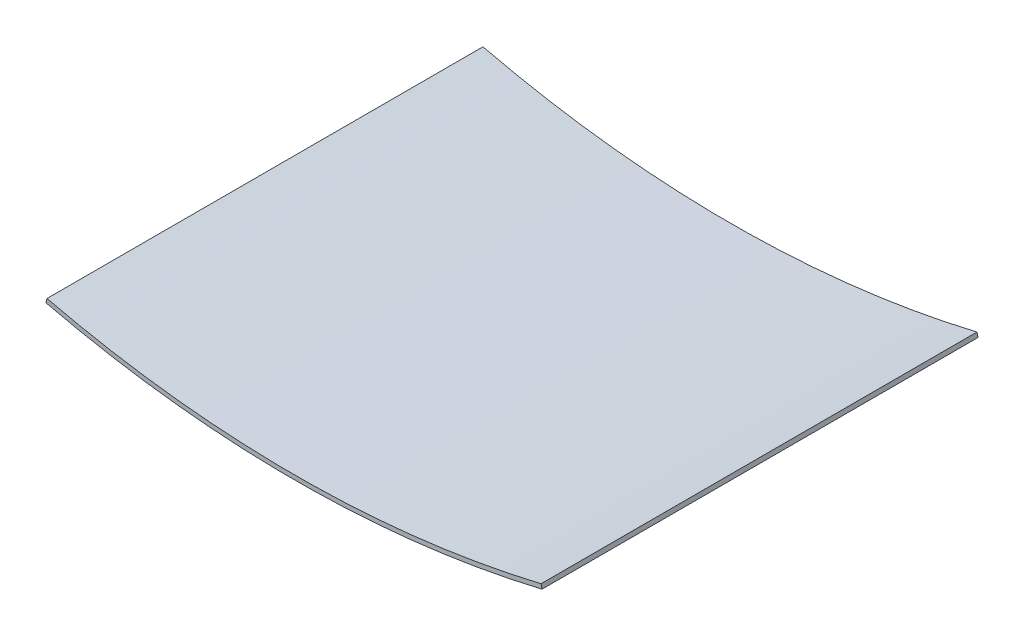
ISO-10303-21;
HEADER;
FILE_DESCRIPTION(('STEP AP214'),'2;1');
FILE_NAME('part.step','',(''),(''),'','','');
FILE_SCHEMA(('AUTOMOTIVE_DESIGN { 1 0 10303 214 1 1 1 1 }'));
ENDSEC;
DATA;
#1=APPLICATION_CONTEXT('core data for automotive mechanical design processes');
#2=APPLICATION_PROTOCOL_DEFINITION('international standard','automotive_design',2000,#1);
#3=PRODUCT_CONTEXT('',#1,'mechanical');
#4=PRODUCT('Part','Part','',(#3));
#5=PRODUCT_RELATED_PRODUCT_CATEGORY('part','',(#4));
#6=PRODUCT_DEFINITION_FORMATION('','',#4);
#7=PRODUCT_DEFINITION_CONTEXT('part definition',#1,'design');
#8=PRODUCT_DEFINITION('design','',#6,#7);
#9=PRODUCT_DEFINITION_SHAPE('','',#8);
#10=(LENGTH_UNIT() NAMED_UNIT(*) SI_UNIT(.MILLI.,.METRE.));
#11=(NAMED_UNIT(*) PLANE_ANGLE_UNIT() SI_UNIT($,.RADIAN.));
#12=(NAMED_UNIT(*) SI_UNIT($,.STERADIAN.) SOLID_ANGLE_UNIT());
#13=UNCERTAINTY_MEASURE_WITH_UNIT(LENGTH_MEASURE(1.E-05),#10,'distance_accuracy_value','');
#14=(GEOMETRIC_REPRESENTATION_CONTEXT(3) GLOBAL_UNCERTAINTY_ASSIGNED_CONTEXT((#13)) GLOBAL_UNIT_ASSIGNED_CONTEXT((#10,
#11,#12)) REPRESENTATION_CONTEXT('',''));
#15=CARTESIAN_POINT('',(0.,0.,0.));
#16=DIRECTION('',(0.,0.,1.));
#17=DIRECTION('',(1.,0.,0.));
#18=AXIS2_PLACEMENT_3D('',#15,#16,#17);
#19=CARTESIAN_POINT('',(-1.11022302462516E-13,930.274999999999,381.));
#20=DIRECTION('',(0.,0.,-1.));
#21=DIRECTION('',(-1.,0.,0.));
#22=AXIS2_PLACEMENT_3D('',#19,#20,#21);
#23=CYLINDRICAL_SURFACE('',#22,934.084999999999);
#24=CARTESIAN_POINT('',(-1.11022302462516E-13,930.274999999999,0.));
#25=DIRECTION('',(0.,0.,1.));
#26=DIRECTION('',(1.,0.,0.));
#27=AXIS2_PLACEMENT_3D('',#24,#25,#26);
#28=CIRCLE('',#27,934.084999999999);
#29=CARTESIAN_POINT('',(-216.784232081911,21.6940273037544,0.));
#30=VERTEX_POINT('',#29);
#31=CARTESIAN_POINT('',(216.784232081911,21.6940273037545,0.));
#32=VERTEX_POINT('',#31);
#33=EDGE_CURVE('E94',#30,#32,#28,.T.);
#34=ORIENTED_EDGE('',*,*,#33,.T.);
#35=DIRECTION('',(0.,0.,-1.));
#36=VECTOR('',#35,1.);
#37=CARTESIAN_POINT('',(216.784232081911,21.6940273037545,381.));
#38=LINE('',#37,#36);
#39=CARTESIAN_POINT('',(216.784232081911,21.6940273037545,381.));
#40=VERTEX_POINT('',#39);
#41=EDGE_CURVE('E11',#40,#32,#38,.T.);
#42=ORIENTED_EDGE('',*,*,#41,.F.);
#43=CARTESIAN_POINT('',(-1.11022302462516E-13,930.274999999999,381.));
#44=DIRECTION('',(0.,0.,1.));
#45=DIRECTION('',(1.,0.,0.));
#46=AXIS2_PLACEMENT_3D('',#43,#44,#45);
#47=CIRCLE('',#46,934.084999999999);
#48=CARTESIAN_POINT('',(-216.784232081911,21.6940273037544,381.));
#49=VERTEX_POINT('',#48);
#50=EDGE_CURVE('E71',#49,#40,#47,.T.);
#51=ORIENTED_EDGE('',*,*,#50,.F.);
#52=DIRECTION('',(0.,0.,-1.));
#53=VECTOR('',#52,1.);
#54=CARTESIAN_POINT('',(-216.784232081911,21.6940273037544,381.));
#55=LINE('',#54,#53);
#56=EDGE_CURVE('E47',#49,#30,#55,.T.);
#57=ORIENTED_EDGE('',*,*,#56,.T.);
#58=EDGE_LOOP('',(#34,#42,#51,#57));
#59=FACE_BOUND('',#58,.T.);
#60=ADVANCED_FACE('F31',(#59),#23,.T.);
#61=CARTESIAN_POINT('',(215.9,25.4000000000001,381.));
#62=DIRECTION('',(0.972696245733786,0.232081911262807,0.));
#63=DIRECTION('',(-0.232081911262807,0.972696245733786,0.));
#64=AXIS2_PLACEMENT_3D('',#61,#62,#63);
#65=PLANE('',#64);
#66=DIRECTION('',(0.232081911262807,-0.972696245733786,0.));
#67=VECTOR('',#66,1.);
#68=CARTESIAN_POINT('',(215.9,25.4000000000001,0.));
#69=LINE('',#68,#67);
#70=CARTESIAN_POINT('',(215.9,25.4000000000001,0.));
#71=VERTEX_POINT('',#70);
#72=EDGE_CURVE('E80',#71,#32,#69,.T.);
#73=ORIENTED_EDGE('',*,*,#72,.F.);
#74=DIRECTION('',(0.,0.,-1.));
#75=VECTOR('',#74,1.);
#76=CARTESIAN_POINT('',(215.9,25.4000000000001,381.));
#77=LINE('',#76,#75);
#78=CARTESIAN_POINT('',(215.9,25.4000000000001,381.));
#79=VERTEX_POINT('',#78);
#80=EDGE_CURVE('E39',#79,#71,#77,.T.);
#81=ORIENTED_EDGE('',*,*,#80,.F.);
#82=DIRECTION('',(0.232081911262807,-0.972696245733786,0.));
#83=VECTOR('',#82,1.);
#84=CARTESIAN_POINT('',(215.9,25.4000000000001,381.));
#85=LINE('',#84,#83);
#86=EDGE_CURVE('E78',#79,#40,#85,.T.);
#87=ORIENTED_EDGE('',*,*,#86,.T.);
#88=ORIENTED_EDGE('',*,*,#41,.T.);
#89=EDGE_LOOP('',(#73,#81,#87,#88));
#90=FACE_BOUND('',#89,.T.);
#91=ADVANCED_FACE('F77',(#90),#65,.T.);
#92=CARTESIAN_POINT('',(-1.11022302462516E-13,930.274999999999,381.));
#93=DIRECTION('',(0.,0.,-1.));
#94=DIRECTION('',(-1.,0.,0.));
#95=AXIS2_PLACEMENT_3D('',#92,#93,#94);
#96=CYLINDRICAL_SURFACE('',#95,930.274999999999);
#97=CARTESIAN_POINT('',(-1.11022302462516E-13,930.274999999999,0.));
#98=DIRECTION('',(0.,0.,1.));
#99=DIRECTION('',(1.,0.,0.));
#100=AXIS2_PLACEMENT_3D('',#97,#98,#99);
#101=CIRCLE('',#100,930.274999999999);
#102=CARTESIAN_POINT('',(-215.9,25.4,0.));
#103=VERTEX_POINT('',#102);
#104=EDGE_CURVE('E97',#103,#71,#101,.T.);
#105=ORIENTED_EDGE('',*,*,#104,.F.);
#106=DIRECTION('',(0.,0.,-1.));
#107=VECTOR('',#106,1.);
#108=CARTESIAN_POINT('',(-215.9,25.4,381.));
#109=LINE('',#108,#107);
#110=CARTESIAN_POINT('',(-215.9,25.4,381.));
#111=VERTEX_POINT('',#110);
#112=EDGE_CURVE('E60',#111,#103,#109,.T.);
#113=ORIENTED_EDGE('',*,*,#112,.F.);
#114=CARTESIAN_POINT('',(-1.11022302462516E-13,930.274999999999,381.));
#115=DIRECTION('',(0.,0.,1.));
#116=DIRECTION('',(1.,0.,0.));
#117=AXIS2_PLACEMENT_3D('',#114,#115,#116);
#118=CIRCLE('',#117,930.274999999999);
#119=EDGE_CURVE('E86',#111,#79,#118,.T.);
#120=ORIENTED_EDGE('',*,*,#119,.T.);
#121=ORIENTED_EDGE('',*,*,#80,.T.);
#122=EDGE_LOOP('',(#105,#113,#120,#121));
#123=FACE_BOUND('',#122,.T.);
#124=ADVANCED_FACE('F88',(#123),#96,.F.);
#125=CARTESIAN_POINT('',(-216.784232081911,21.6940273037544,381.));
#126=DIRECTION('',(-0.972696245733788,0.2320819112628,0.));
#127=DIRECTION('',(-0.2320819112628,-0.972696245733788,0.));
#128=AXIS2_PLACEMENT_3D('',#125,#126,#127);
#129=PLANE('',#128);
#130=DIRECTION('',(0.2320819112628,0.972696245733788,0.));
#131=VECTOR('',#130,1.);
#132=CARTESIAN_POINT('',(-216.784232081911,21.6940273037544,0.));
#133=LINE('',#132,#131);
#134=EDGE_CURVE('E99',#30,#103,#133,.T.);
#135=ORIENTED_EDGE('',*,*,#134,.F.);
#136=ORIENTED_EDGE('',*,*,#56,.F.);
#137=DIRECTION('',(0.2320819112628,0.972696245733788,0.));
#138=VECTOR('',#137,1.);
#139=CARTESIAN_POINT('',(-216.784232081911,21.6940273037544,381.));
#140=LINE('',#139,#138);
#141=EDGE_CURVE('E89',#49,#111,#140,.T.);
#142=ORIENTED_EDGE('',*,*,#141,.T.);
#143=ORIENTED_EDGE('',*,*,#112,.T.);
#144=EDGE_LOOP('',(#135,#136,#142,#143));
#145=FACE_BOUND('',#144,.T.);
#146=ADVANCED_FACE('F105',(#145),#129,.T.);
#147=CARTESIAN_POINT('',(-1.11022302462516E-13,930.274999999999,381.));
#148=DIRECTION('',(0.,0.,1.));
#149=DIRECTION('',(1.,0.,0.));
#150=AXIS2_PLACEMENT_3D('',#147,#148,#149);
#151=PLANE('',#150);
#152=ORIENTED_EDGE('',*,*,#50,.T.);
#153=ORIENTED_EDGE('',*,*,#86,.F.);
#154=ORIENTED_EDGE('',*,*,#119,.F.);
#155=ORIENTED_EDGE('',*,*,#141,.F.);
#156=EDGE_LOOP('',(#152,#153,#154,#155));
#157=FACE_BOUND('',#156,.T.);
#158=ADVANCED_FACE('F85',(#157),#151,.T.);
#159=CARTESIAN_POINT('',(-1.11022302462516E-13,930.274999999999,0.));
#160=DIRECTION('',(0.,0.,1.));
#161=DIRECTION('',(1.,0.,0.));
#162=AXIS2_PLACEMENT_3D('',#159,#160,#161);
#163=PLANE('',#162);
#164=ORIENTED_EDGE('',*,*,#33,.F.);
#165=ORIENTED_EDGE('',*,*,#134,.T.);
#166=ORIENTED_EDGE('',*,*,#104,.T.);
#167=ORIENTED_EDGE('',*,*,#72,.T.);
#168=EDGE_LOOP('',(#164,#165,#166,#167));
#169=FACE_BOUND('',#168,.T.);
#170=ADVANCED_FACE('F104',(#169),#163,.F.);
#171=CLOSED_SHELL('',(#60,#91,#124,#146,#158,#170));
#172=MANIFOLD_SOLID_BREP('B2',#171);
#173=ADVANCED_BREP_SHAPE_REPRESENTATION('',(#18,#172),#14);
#174=SHAPE_DEFINITION_REPRESENTATION(#9,#173);
ENDSEC;
END-ISO-10303-21;
